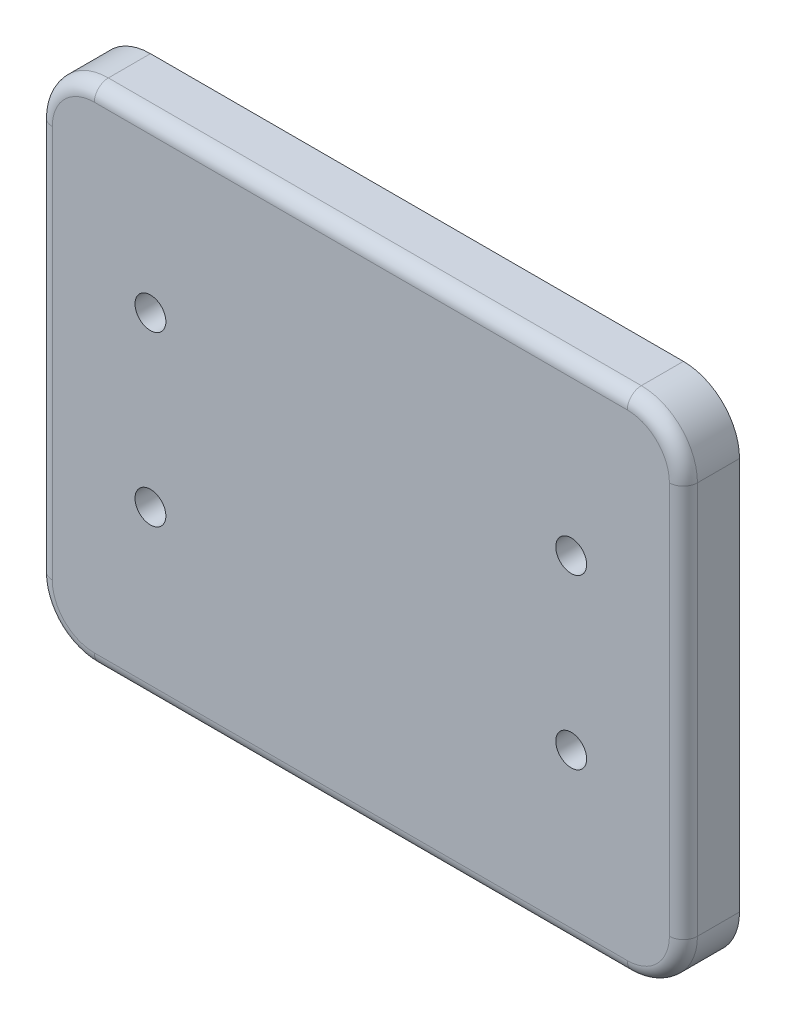
ISO-10303-21;
HEADER;
FILE_DESCRIPTION(('STEP AP214'),'2;1');
FILE_NAME('part.step','',(''),(''),'','','');
FILE_SCHEMA(('AUTOMOTIVE_DESIGN { 1 0 10303 214 1 1 1 1 }'));
ENDSEC;
DATA;
#1=APPLICATION_CONTEXT('core data for automotive mechanical design processes');
#2=APPLICATION_PROTOCOL_DEFINITION('international standard','automotive_design',2000,#1);
#3=PRODUCT_CONTEXT('',#1,'mechanical');
#4=PRODUCT('Part','Part','',(#3));
#5=PRODUCT_RELATED_PRODUCT_CATEGORY('part','',(#4));
#6=PRODUCT_DEFINITION_FORMATION('','',#4);
#7=PRODUCT_DEFINITION_CONTEXT('part definition',#1,'design');
#8=PRODUCT_DEFINITION('design','',#6,#7);
#9=PRODUCT_DEFINITION_SHAPE('','',#8);
#10=(LENGTH_UNIT() NAMED_UNIT(*) SI_UNIT(.MILLI.,.METRE.));
#11=(NAMED_UNIT(*) PLANE_ANGLE_UNIT() SI_UNIT($,.RADIAN.));
#12=(NAMED_UNIT(*) SI_UNIT($,.STERADIAN.) SOLID_ANGLE_UNIT());
#13=UNCERTAINTY_MEASURE_WITH_UNIT(LENGTH_MEASURE(1.E-05),#10,'distance_accuracy_value','');
#14=(GEOMETRIC_REPRESENTATION_CONTEXT(3) GLOBAL_UNCERTAINTY_ASSIGNED_CONTEXT((#13)) GLOBAL_UNIT_ASSIGNED_CONTEXT((#10,
#11,#12)) REPRESENTATION_CONTEXT('',''));
#15=CARTESIAN_POINT('',(0.,0.,0.));
#16=DIRECTION('',(0.,0.,1.));
#17=DIRECTION('',(1.,0.,0.));
#18=AXIS2_PLACEMENT_3D('',#15,#16,#17);
#19=CARTESIAN_POINT('',(75.,-30.,0.));
#20=DIRECTION('',(0.,0.,1.));
#21=DIRECTION('',(1.,0.,0.));
#22=AXIS2_PLACEMENT_3D('',#19,#20,#21);
#23=CYLINDRICAL_SURFACE('',#22,5.5);
#24=CARTESIAN_POINT('',(75.,-30.,20.));
#25=DIRECTION('',(0.,0.,-1.));
#26=DIRECTION('',(1.,0.,0.));
#27=AXIS2_PLACEMENT_3D('',#24,#25,#26);
#28=CIRCLE('',#27,5.5);
#29=CARTESIAN_POINT('',(80.5,-30.,20.));
#30=VERTEX_POINT('',#29);
#31=EDGE_CURVE('E245',#30,#30,#28,.T.);
#32=ORIENTED_EDGE('',*,*,#31,.F.);
#33=EDGE_LOOP('',(#32));
#34=FACE_BOUND('',#33,.T.);
#35=CARTESIAN_POINT('',(75.,-30.,11.));
#36=DIRECTION('',(0.,0.,-1.));
#37=DIRECTION('',(-1.,0.,0.));
#38=AXIS2_PLACEMENT_3D('',#35,#36,#37);
#39=CIRCLE('',#38,5.5);
#40=CARTESIAN_POINT('',(69.5,-30.,11.));
#41=VERTEX_POINT('',#40);
#42=EDGE_CURVE('E41',#41,#41,#39,.T.);
#43=ORIENTED_EDGE('',*,*,#42,.T.);
#44=EDGE_LOOP('',(#43));
#45=FACE_BOUND('',#44,.T.);
#46=ADVANCED_FACE('F37',(#34,#45),#23,.F.);
#47=CARTESIAN_POINT('',(-75.,-30.,0.));
#48=DIRECTION('',(0.,0.,1.));
#49=DIRECTION('',(1.,0.,0.));
#50=AXIS2_PLACEMENT_3D('',#47,#48,#49);
#51=CYLINDRICAL_SURFACE('',#50,5.5);
#52=CARTESIAN_POINT('',(-75.,-30.,20.));
#53=DIRECTION('',(0.,0.,-1.));
#54=DIRECTION('',(1.,0.,0.));
#55=AXIS2_PLACEMENT_3D('',#52,#53,#54);
#56=CIRCLE('',#55,5.5);
#57=CARTESIAN_POINT('',(-69.5,-30.,20.));
#58=VERTEX_POINT('',#57);
#59=EDGE_CURVE('E260',#58,#58,#56,.T.);
#60=ORIENTED_EDGE('',*,*,#59,.F.);
#61=EDGE_LOOP('',(#60));
#62=FACE_BOUND('',#61,.T.);
#63=CARTESIAN_POINT('',(-75.,-30.,11.));
#64=DIRECTION('',(0.,0.,-1.));
#65=DIRECTION('',(-1.,0.,0.));
#66=AXIS2_PLACEMENT_3D('',#63,#64,#65);
#67=CIRCLE('',#66,5.5);
#68=CARTESIAN_POINT('',(-80.5,-30.,11.));
#69=VERTEX_POINT('',#68);
#70=EDGE_CURVE('E239',#69,#69,#67,.T.);
#71=ORIENTED_EDGE('',*,*,#70,.T.);
#72=EDGE_LOOP('',(#71));
#73=FACE_BOUND('',#72,.T.);
#74=ADVANCED_FACE('F348',(#62,#73),#51,.F.);
#75=CARTESIAN_POINT('',(75.,30.,0.));
#76=DIRECTION('',(0.,0.,1.));
#77=DIRECTION('',(1.,0.,0.));
#78=AXIS2_PLACEMENT_3D('',#75,#76,#77);
#79=CYLINDRICAL_SURFACE('',#78,5.5);
#80=CARTESIAN_POINT('',(75.,30.,20.));
#81=DIRECTION('',(0.,0.,1.));
#82=DIRECTION('',(1.,0.,0.));
#83=AXIS2_PLACEMENT_3D('',#80,#81,#82);
#84=CIRCLE('',#83,5.5);
#85=CARTESIAN_POINT('',(80.5,30.,20.));
#86=VERTEX_POINT('',#85);
#87=EDGE_CURVE('E155',#86,#86,#84,.T.);
#88=ORIENTED_EDGE('',*,*,#87,.T.);
#89=EDGE_LOOP('',(#88));
#90=FACE_BOUND('',#89,.T.);
#91=CARTESIAN_POINT('',(75.,30.,11.));
#92=DIRECTION('',(0.,0.,-1.));
#93=DIRECTION('',(-1.,0.,0.));
#94=AXIS2_PLACEMENT_3D('',#91,#92,#93);
#95=CIRCLE('',#94,5.5);
#96=CARTESIAN_POINT('',(69.5,30.,11.));
#97=VERTEX_POINT('',#96);
#98=EDGE_CURVE('E236',#97,#97,#95,.F.);
#99=ORIENTED_EDGE('',*,*,#98,.F.);
#100=EDGE_LOOP('',(#99));
#101=FACE_BOUND('',#100,.T.);
#102=ADVANCED_FACE('F281',(#90,#101),#79,.F.);
#103=CARTESIAN_POINT('',(-75.,30.,0.));
#104=DIRECTION('',(0.,0.,1.));
#105=DIRECTION('',(1.,0.,0.));
#106=AXIS2_PLACEMENT_3D('',#103,#104,#105);
#107=CYLINDRICAL_SURFACE('',#106,5.5);
#108=CARTESIAN_POINT('',(-75.,30.,20.));
#109=DIRECTION('',(0.,0.,1.));
#110=DIRECTION('',(1.,0.,0.));
#111=AXIS2_PLACEMENT_3D('',#108,#109,#110);
#112=CIRCLE('',#111,5.5);
#113=CARTESIAN_POINT('',(-69.5,30.,20.));
#114=VERTEX_POINT('',#113);
#115=EDGE_CURVE('E217',#114,#114,#112,.T.);
#116=ORIENTED_EDGE('',*,*,#115,.T.);
#117=EDGE_LOOP('',(#116));
#118=FACE_BOUND('',#117,.T.);
#119=CARTESIAN_POINT('',(-75.,30.,11.));
#120=DIRECTION('',(0.,0.,-1.));
#121=DIRECTION('',(-1.,0.,0.));
#122=AXIS2_PLACEMENT_3D('',#119,#120,#121);
#123=CIRCLE('',#122,5.5);
#124=CARTESIAN_POINT('',(-80.5,30.,11.));
#125=VERTEX_POINT('',#124);
#126=EDGE_CURVE('E233',#125,#125,#123,.F.);
#127=ORIENTED_EDGE('',*,*,#126,.F.);
#128=EDGE_LOOP('',(#127));
#129=FACE_BOUND('',#128,.T.);
#130=ADVANCED_FACE('F377',(#118,#129),#107,.F.);
#131=CARTESIAN_POINT('',(-95.,70.,20.));
#132=DIRECTION('',(0.,0.,-1.));
#133=DIRECTION('',(-1.,0.,0.));
#134=AXIS2_PLACEMENT_3D('',#131,#132,#133);
#135=CYLINDRICAL_SURFACE('',#134,20.);
#136=DIRECTION('',(0.,0.,-1.));
#137=VECTOR('',#136,1.);
#138=CARTESIAN_POINT('',(-115.,69.9999999999999,20.));
#139=LINE('',#138,#137);
#140=CARTESIAN_POINT('',(-115.,69.9999999999999,15.));
#141=VERTEX_POINT('',#140);
#142=CARTESIAN_POINT('',(-115.,69.9999999999999,0.));
#143=VERTEX_POINT('',#142);
#144=EDGE_CURVE('E125',#141,#143,#139,.T.);
#145=ORIENTED_EDGE('',*,*,#144,.F.);
#146=CARTESIAN_POINT('',(-95.,70.,15.));
#147=DIRECTION('',(0.,0.,1.));
#148=DIRECTION('',(1.,0.,0.));
#149=AXIS2_PLACEMENT_3D('',#146,#147,#148);
#150=CIRCLE('',#149,20.);
#151=CARTESIAN_POINT('',(-94.9999999999998,90.,15.));
#152=VERTEX_POINT('',#151);
#153=EDGE_CURVE('E11',#141,#152,#150,.F.);
#154=ORIENTED_EDGE('',*,*,#153,.T.);
#155=DIRECTION('',(0.,0.,-1.));
#156=VECTOR('',#155,1.);
#157=CARTESIAN_POINT('',(-94.9999999999998,90.,20.));
#158=LINE('',#157,#156);
#159=CARTESIAN_POINT('',(-94.9999999999998,90.,0.));
#160=VERTEX_POINT('',#159);
#161=EDGE_CURVE('E147',#152,#160,#158,.T.);
#162=ORIENTED_EDGE('',*,*,#161,.T.);
#163=CARTESIAN_POINT('',(-95.,70.,0.));
#164=DIRECTION('',(0.,0.,1.));
#165=DIRECTION('',(1.,0.,0.));
#166=AXIS2_PLACEMENT_3D('',#163,#164,#165);
#167=CIRCLE('',#166,20.);
#168=EDGE_CURVE('E140',#160,#143,#167,.T.);
#169=ORIENTED_EDGE('',*,*,#168,.T.);
#170=EDGE_LOOP('',(#145,#154,#162,#169));
#171=FACE_BOUND('',#170,.T.);
#172=ADVANCED_FACE('F145',(#171),#135,.T.);
#173=CARTESIAN_POINT('',(-115.,69.9999999999999,20.));
#174=DIRECTION('',(1.,0.,0.));
#175=DIRECTION('',(0.,1.,0.));
#176=AXIS2_PLACEMENT_3D('',#173,#174,#175);
#177=PLANE('',#176);
#178=DIRECTION('',(0.,0.,-1.));
#179=VECTOR('',#178,1.);
#180=CARTESIAN_POINT('',(-115.,-70.,20.));
#181=LINE('',#180,#179);
#182=CARTESIAN_POINT('',(-115.,-70.,15.));
#183=VERTEX_POINT('',#182);
#184=CARTESIAN_POINT('',(-115.,-70.,0.));
#185=VERTEX_POINT('',#184);
#186=EDGE_CURVE('E134',#183,#185,#181,.T.);
#187=ORIENTED_EDGE('',*,*,#186,.F.);
#188=DIRECTION('',(0.,-1.,0.));
#189=VECTOR('',#188,1.);
#190=CARTESIAN_POINT('',(-115.,69.9999999999999,15.));
#191=LINE('',#190,#189);
#192=EDGE_CURVE('E46',#183,#141,#191,.F.);
#193=ORIENTED_EDGE('',*,*,#192,.T.);
#194=ORIENTED_EDGE('',*,*,#144,.T.);
#195=DIRECTION('',(0.,-1.,0.));
#196=VECTOR('',#195,1.);
#197=CARTESIAN_POINT('',(-115.,69.9999999999999,0.));
#198=LINE('',#197,#196);
#199=EDGE_CURVE('E128',#143,#185,#198,.T.);
#200=ORIENTED_EDGE('',*,*,#199,.T.);
#201=EDGE_LOOP('',(#187,#193,#194,#200));
#202=FACE_BOUND('',#201,.T.);
#203=ADVANCED_FACE('F127',(#202),#177,.F.);
#204=CARTESIAN_POINT('',(-95.,-70.,20.));
#205=DIRECTION('',(0.,0.,-1.));
#206=DIRECTION('',(-1.,0.,0.));
#207=AXIS2_PLACEMENT_3D('',#204,#205,#206);
#208=CYLINDRICAL_SURFACE('',#207,20.);
#209=DIRECTION('',(0.,0.,-1.));
#210=VECTOR('',#209,1.);
#211=CARTESIAN_POINT('',(-94.9999999999998,-90.,20.));
#212=LINE('',#211,#210);
#213=CARTESIAN_POINT('',(-94.9999999999998,-90.,15.));
#214=VERTEX_POINT('',#213);
#215=CARTESIAN_POINT('',(-94.9999999999998,-90.,0.));
#216=VERTEX_POINT('',#215);
#217=EDGE_CURVE('E182',#214,#216,#212,.T.);
#218=ORIENTED_EDGE('',*,*,#217,.F.);
#219=CARTESIAN_POINT('',(-95.,-70.,15.));
#220=DIRECTION('',(0.,0.,1.));
#221=DIRECTION('',(1.,0.,0.));
#222=AXIS2_PLACEMENT_3D('',#219,#220,#221);
#223=CIRCLE('',#222,20.);
#224=EDGE_CURVE('E61',#214,#183,#223,.F.);
#225=ORIENTED_EDGE('',*,*,#224,.T.);
#226=ORIENTED_EDGE('',*,*,#186,.T.);
#227=CARTESIAN_POINT('',(-95.,-70.,0.));
#228=DIRECTION('',(0.,0.,1.));
#229=DIRECTION('',(-1.,0.,0.));
#230=AXIS2_PLACEMENT_3D('',#227,#228,#229);
#231=CIRCLE('',#230,20.);
#232=EDGE_CURVE('E143',#185,#216,#231,.T.);
#233=ORIENTED_EDGE('',*,*,#232,.T.);
#234=EDGE_LOOP('',(#218,#225,#226,#233));
#235=FACE_BOUND('',#234,.T.);
#236=ADVANCED_FACE('F601',(#235),#208,.T.);
#237=CARTESIAN_POINT('',(94.9999999999999,-90.,20.));
#238=DIRECTION('',(0.,1.,0.));
#239=DIRECTION('',(-1.,0.,0.));
#240=AXIS2_PLACEMENT_3D('',#237,#238,#239);
#241=PLANE('',#240);
#242=DIRECTION('',(0.,0.,-1.));
#243=VECTOR('',#242,1.);
#244=CARTESIAN_POINT('',(94.9999999999999,-90.,20.));
#245=LINE('',#244,#243);
#246=CARTESIAN_POINT('',(94.9999999999999,-90.,15.));
#247=VERTEX_POINT('',#246);
#248=CARTESIAN_POINT('',(94.9999999999999,-90.,0.));
#249=VERTEX_POINT('',#248);
#250=EDGE_CURVE('E180',#247,#249,#245,.T.);
#251=ORIENTED_EDGE('',*,*,#250,.F.);
#252=DIRECTION('',(1.,0.,0.));
#253=VECTOR('',#252,1.);
#254=CARTESIAN_POINT('',(-94.9999999999998,-90.,15.));
#255=LINE('',#254,#253);
#256=EDGE_CURVE('E210',#247,#214,#255,.F.);
#257=ORIENTED_EDGE('',*,*,#256,.T.);
#258=ORIENTED_EDGE('',*,*,#217,.T.);
#259=DIRECTION('',(1.,0.,0.));
#260=VECTOR('',#259,1.);
#261=CARTESIAN_POINT('',(94.9999999999999,-90.,0.));
#262=LINE('',#261,#260);
#263=EDGE_CURVE('E159',#216,#249,#262,.T.);
#264=ORIENTED_EDGE('',*,*,#263,.T.);
#265=EDGE_LOOP('',(#251,#257,#258,#264));
#266=FACE_BOUND('',#265,.T.);
#267=ADVANCED_FACE('F591',(#266),#241,.F.);
#268=CARTESIAN_POINT('',(95.,-70.,20.));
#269=DIRECTION('',(0.,0.,-1.));
#270=DIRECTION('',(-1.,0.,0.));
#271=AXIS2_PLACEMENT_3D('',#268,#269,#270);
#272=CYLINDRICAL_SURFACE('',#271,20.);
#273=DIRECTION('',(0.,0.,-1.));
#274=VECTOR('',#273,1.);
#275=CARTESIAN_POINT('',(115.,-69.9999999999998,20.));
#276=LINE('',#275,#274);
#277=CARTESIAN_POINT('',(115.,-69.9999999999998,15.));
#278=VERTEX_POINT('',#277);
#279=CARTESIAN_POINT('',(115.,-69.9999999999998,0.));
#280=VERTEX_POINT('',#279);
#281=EDGE_CURVE('E178',#278,#280,#276,.T.);
#282=ORIENTED_EDGE('',*,*,#281,.F.);
#283=CARTESIAN_POINT('',(95.,-70.,15.));
#284=DIRECTION('',(0.,0.,1.));
#285=DIRECTION('',(1.,0.,0.));
#286=AXIS2_PLACEMENT_3D('',#283,#284,#285);
#287=CIRCLE('',#286,20.);
#288=EDGE_CURVE('E208',#278,#247,#287,.F.);
#289=ORIENTED_EDGE('',*,*,#288,.T.);
#290=ORIENTED_EDGE('',*,*,#250,.T.);
#291=CARTESIAN_POINT('',(95.,-70.,0.));
#292=DIRECTION('',(0.,0.,1.));
#293=DIRECTION('',(-1.,0.,0.));
#294=AXIS2_PLACEMENT_3D('',#291,#292,#293);
#295=CIRCLE('',#294,20.);
#296=EDGE_CURVE('E162',#249,#280,#295,.T.);
#297=ORIENTED_EDGE('',*,*,#296,.T.);
#298=EDGE_LOOP('',(#282,#289,#290,#297));
#299=FACE_BOUND('',#298,.T.);
#300=ADVANCED_FACE('F331',(#299),#272,.T.);
#301=CARTESIAN_POINT('',(115.,69.9999999999999,20.));
#302=DIRECTION('',(-1.,0.,0.));
#303=DIRECTION('',(0.,-1.,0.));
#304=AXIS2_PLACEMENT_3D('',#301,#302,#303);
#305=PLANE('',#304);
#306=DIRECTION('',(0.,0.,-1.));
#307=VECTOR('',#306,1.);
#308=CARTESIAN_POINT('',(115.,69.9999999999999,20.));
#309=LINE('',#308,#307);
#310=CARTESIAN_POINT('',(115.,69.9999999999999,15.));
#311=VERTEX_POINT('',#310);
#312=CARTESIAN_POINT('',(115.,69.9999999999999,0.));
#313=VERTEX_POINT('',#312);
#314=EDGE_CURVE('E176',#311,#313,#309,.T.);
#315=ORIENTED_EDGE('',*,*,#314,.F.);
#316=DIRECTION('',(0.,1.,0.));
#317=VECTOR('',#316,1.);
#318=CARTESIAN_POINT('',(115.,-69.9999999999998,15.));
#319=LINE('',#318,#317);
#320=EDGE_CURVE('E206',#311,#278,#319,.F.);
#321=ORIENTED_EDGE('',*,*,#320,.T.);
#322=ORIENTED_EDGE('',*,*,#281,.T.);
#323=DIRECTION('',(0.,1.,0.));
#324=VECTOR('',#323,1.);
#325=CARTESIAN_POINT('',(115.,69.9999999999999,0.));
#326=LINE('',#325,#324);
#327=EDGE_CURVE('E165',#280,#313,#326,.T.);
#328=ORIENTED_EDGE('',*,*,#327,.T.);
#329=EDGE_LOOP('',(#315,#321,#322,#328));
#330=FACE_BOUND('',#329,.T.);
#331=ADVANCED_FACE('F329',(#330),#305,.F.);
#332=CARTESIAN_POINT('',(95.,70.,20.));
#333=DIRECTION('',(0.,0.,-1.));
#334=DIRECTION('',(-1.,0.,0.));
#335=AXIS2_PLACEMENT_3D('',#332,#333,#334);
#336=CYLINDRICAL_SURFACE('',#335,20.);
#337=DIRECTION('',(0.,0.,-1.));
#338=VECTOR('',#337,1.);
#339=CARTESIAN_POINT('',(94.9999999999999,90.,20.));
#340=LINE('',#339,#338);
#341=CARTESIAN_POINT('',(94.9999999999999,90.,15.));
#342=VERTEX_POINT('',#341);
#343=CARTESIAN_POINT('',(94.9999999999999,90.,0.));
#344=VERTEX_POINT('',#343);
#345=EDGE_CURVE('E174',#342,#344,#340,.T.);
#346=ORIENTED_EDGE('',*,*,#345,.F.);
#347=CARTESIAN_POINT('',(95.,70.,15.));
#348=DIRECTION('',(0.,0.,1.));
#349=DIRECTION('',(1.,0.,0.));
#350=AXIS2_PLACEMENT_3D('',#347,#348,#349);
#351=CIRCLE('',#350,20.);
#352=EDGE_CURVE('E204',#342,#311,#351,.F.);
#353=ORIENTED_EDGE('',*,*,#352,.T.);
#354=ORIENTED_EDGE('',*,*,#314,.T.);
#355=CARTESIAN_POINT('',(95.,70.,0.));
#356=DIRECTION('',(0.,0.,1.));
#357=DIRECTION('',(-1.,0.,0.));
#358=AXIS2_PLACEMENT_3D('',#355,#356,#357);
#359=CIRCLE('',#358,20.);
#360=EDGE_CURVE('E168',#313,#344,#359,.T.);
#361=ORIENTED_EDGE('',*,*,#360,.T.);
#362=EDGE_LOOP('',(#346,#353,#354,#361));
#363=FACE_BOUND('',#362,.T.);
#364=ADVANCED_FACE('F338',(#363),#336,.T.);
#365=CARTESIAN_POINT('',(94.9999999999999,90.,20.));
#366=DIRECTION('',(0.,-1.,0.));
#367=DIRECTION('',(1.,0.,0.));
#368=AXIS2_PLACEMENT_3D('',#365,#366,#367);
#369=PLANE('',#368);
#370=ORIENTED_EDGE('',*,*,#161,.F.);
#371=DIRECTION('',(-1.,0.,0.));
#372=VECTOR('',#371,1.);
#373=CARTESIAN_POINT('',(94.9999999999998,90.,15.));
#374=LINE('',#373,#372);
#375=EDGE_CURVE('E201',#152,#342,#374,.F.);
#376=ORIENTED_EDGE('',*,*,#375,.T.);
#377=ORIENTED_EDGE('',*,*,#345,.T.);
#378=DIRECTION('',(-1.,0.,0.));
#379=VECTOR('',#378,1.);
#380=CARTESIAN_POINT('',(94.9999999999999,90.,0.));
#381=LINE('',#380,#379);
#382=EDGE_CURVE('E171',#344,#160,#381,.T.);
#383=ORIENTED_EDGE('',*,*,#382,.T.);
#384=EDGE_LOOP('',(#370,#376,#377,#383));
#385=FACE_BOUND('',#384,.T.);
#386=ADVANCED_FACE('F287',(#385),#369,.F.);
#387=CARTESIAN_POINT('',(-95.,70.,20.));
#388=DIRECTION('',(0.,0.,1.));
#389=DIRECTION('',(1.,0.,0.));
#390=AXIS2_PLACEMENT_3D('',#387,#388,#389);
#391=PLANE('',#390);
#392=ORIENTED_EDGE('',*,*,#59,.T.);
#393=EDGE_LOOP('',(#392));
#394=FACE_BOUND('',#393,.T.);
#395=ORIENTED_EDGE('',*,*,#31,.T.);
#396=EDGE_LOOP('',(#395));
#397=FACE_BOUND('',#396,.T.);
#398=ORIENTED_EDGE('',*,*,#115,.F.);
#399=EDGE_LOOP('',(#398));
#400=FACE_BOUND('',#399,.T.);
#401=ORIENTED_EDGE('',*,*,#87,.F.);
#402=EDGE_LOOP('',(#401));
#403=FACE_BOUND('',#402,.T.);
#404=CARTESIAN_POINT('',(95.,70.,20.));
#405=DIRECTION('',(0.,0.,1.));
#406=DIRECTION('',(1.,0.,0.));
#407=AXIS2_PLACEMENT_3D('',#404,#405,#406);
#408=CIRCLE('',#407,15.);
#409=CARTESIAN_POINT('',(110.,69.9999999999999,20.));
#410=VERTEX_POINT('',#409);
#411=CARTESIAN_POINT('',(94.9999999999999,85.,20.));
#412=VERTEX_POINT('',#411);
#413=EDGE_CURVE('E196',#410,#412,#408,.T.);
#414=ORIENTED_EDGE('',*,*,#413,.T.);
#415=DIRECTION('',(-1.,0.,0.));
#416=VECTOR('',#415,1.);
#417=CARTESIAN_POINT('',(-94.9999999999998,85.,20.));
#418=LINE('',#417,#416);
#419=CARTESIAN_POINT('',(-94.9999999999998,85.,20.));
#420=VERTEX_POINT('',#419);
#421=EDGE_CURVE('E198',#412,#420,#418,.T.);
#422=ORIENTED_EDGE('',*,*,#421,.T.);
#423=CARTESIAN_POINT('',(-95.,70.,20.));
#424=DIRECTION('',(0.,0.,1.));
#425=DIRECTION('',(1.,0.,0.));
#426=AXIS2_PLACEMENT_3D('',#423,#424,#425);
#427=CIRCLE('',#426,15.);
#428=CARTESIAN_POINT('',(-110.,69.9999999999999,20.));
#429=VERTEX_POINT('',#428);
#430=EDGE_CURVE('E133',#420,#429,#427,.T.);
#431=ORIENTED_EDGE('',*,*,#430,.T.);
#432=DIRECTION('',(0.,-1.,0.));
#433=VECTOR('',#432,1.);
#434=CARTESIAN_POINT('',(-110.,-70.,20.));
#435=LINE('',#434,#433);
#436=CARTESIAN_POINT('',(-110.,-70.,20.));
#437=VERTEX_POINT('',#436);
#438=EDGE_CURVE('E186',#429,#437,#435,.T.);
#439=ORIENTED_EDGE('',*,*,#438,.T.);
#440=CARTESIAN_POINT('',(-95.,-70.,20.));
#441=DIRECTION('',(0.,0.,1.));
#442=DIRECTION('',(1.,0.,0.));
#443=AXIS2_PLACEMENT_3D('',#440,#441,#442);
#444=CIRCLE('',#443,15.);
#445=CARTESIAN_POINT('',(-94.9999999999998,-85.,20.));
#446=VERTEX_POINT('',#445);
#447=EDGE_CURVE('E188',#437,#446,#444,.T.);
#448=ORIENTED_EDGE('',*,*,#447,.T.);
#449=DIRECTION('',(1.,0.,0.));
#450=VECTOR('',#449,1.);
#451=CARTESIAN_POINT('',(94.9999999999999,-85.,20.));
#452=LINE('',#451,#450);
#453=CARTESIAN_POINT('',(94.9999999999999,-85.,20.));
#454=VERTEX_POINT('',#453);
#455=EDGE_CURVE('E190',#446,#454,#452,.T.);
#456=ORIENTED_EDGE('',*,*,#455,.T.);
#457=CARTESIAN_POINT('',(95.,-70.,20.));
#458=DIRECTION('',(0.,0.,1.));
#459=DIRECTION('',(1.,0.,0.));
#460=AXIS2_PLACEMENT_3D('',#457,#458,#459);
#461=CIRCLE('',#460,15.);
#462=CARTESIAN_POINT('',(110.,-69.9999999999998,20.));
#463=VERTEX_POINT('',#462);
#464=EDGE_CURVE('E192',#454,#463,#461,.T.);
#465=ORIENTED_EDGE('',*,*,#464,.T.);
#466=DIRECTION('',(0.,1.,0.));
#467=VECTOR('',#466,1.);
#468=CARTESIAN_POINT('',(110.,69.9999999999999,20.));
#469=LINE('',#468,#467);
#470=EDGE_CURVE('E194',#463,#410,#469,.T.);
#471=ORIENTED_EDGE('',*,*,#470,.T.);
#472=EDGE_LOOP('',(#414,#422,#431,#439,#448,#456,#465,#471));
#473=FACE_BOUND('',#472,.T.);
#474=ADVANCED_FACE('F284',(#394,#397,#400,#403,#473),#391,.T.);
#475=CARTESIAN_POINT('',(-95.,70.,0.));
#476=DIRECTION('',(0.,0.,1.));
#477=DIRECTION('',(1.,0.,0.));
#478=AXIS2_PLACEMENT_3D('',#475,#476,#477);
#479=PLANE('',#478);
#480=CARTESIAN_POINT('',(75.,-30.,0.));
#481=DIRECTION('',(0.,0.,1.));
#482=DIRECTION('',(-1.,0.,0.));
#483=AXIS2_PLACEMENT_3D('',#480,#481,#482);
#484=CIRCLE('',#483,9.);
#485=CARTESIAN_POINT('',(66.,-30.,0.));
#486=VERTEX_POINT('',#485);
#487=EDGE_CURVE('E247',#486,#486,#484,.T.);
#488=ORIENTED_EDGE('',*,*,#487,.T.);
#489=EDGE_LOOP('',(#488));
#490=FACE_BOUND('',#489,.T.);
#491=CARTESIAN_POINT('',(-75.,-30.,0.));
#492=DIRECTION('',(0.,0.,1.));
#493=DIRECTION('',(-1.,0.,0.));
#494=AXIS2_PLACEMENT_3D('',#491,#492,#493);
#495=CIRCLE('',#494,9.);
#496=CARTESIAN_POINT('',(-84.,-30.,0.));
#497=VERTEX_POINT('',#496);
#498=EDGE_CURVE('E257',#497,#497,#495,.T.);
#499=ORIENTED_EDGE('',*,*,#498,.T.);
#500=EDGE_LOOP('',(#499));
#501=FACE_BOUND('',#500,.T.);
#502=CARTESIAN_POINT('',(75.,30.,0.));
#503=DIRECTION('',(0.,0.,-1.));
#504=DIRECTION('',(-1.,0.,0.));
#505=AXIS2_PLACEMENT_3D('',#502,#503,#504);
#506=CIRCLE('',#505,9.);
#507=CARTESIAN_POINT('',(66.,30.,0.));
#508=VERTEX_POINT('',#507);
#509=EDGE_CURVE('E268',#508,#508,#506,.T.);
#510=ORIENTED_EDGE('',*,*,#509,.F.);
#511=EDGE_LOOP('',(#510));
#512=FACE_BOUND('',#511,.T.);
#513=CARTESIAN_POINT('',(-75.,30.,0.));
#514=DIRECTION('',(0.,0.,-1.));
#515=DIRECTION('',(-1.,0.,0.));
#516=AXIS2_PLACEMENT_3D('',#513,#514,#515);
#517=CIRCLE('',#516,9.);
#518=CARTESIAN_POINT('',(-84.,30.,0.));
#519=VERTEX_POINT('',#518);
#520=EDGE_CURVE('E271',#519,#519,#517,.T.);
#521=ORIENTED_EDGE('',*,*,#520,.F.);
#522=EDGE_LOOP('',(#521));
#523=FACE_BOUND('',#522,.T.);
#524=ORIENTED_EDGE('',*,*,#168,.F.);
#525=ORIENTED_EDGE('',*,*,#382,.F.);
#526=ORIENTED_EDGE('',*,*,#360,.F.);
#527=ORIENTED_EDGE('',*,*,#327,.F.);
#528=ORIENTED_EDGE('',*,*,#296,.F.);
#529=ORIENTED_EDGE('',*,*,#263,.F.);
#530=ORIENTED_EDGE('',*,*,#232,.F.);
#531=ORIENTED_EDGE('',*,*,#199,.F.);
#532=EDGE_LOOP('',(#524,#525,#526,#527,#528,#529,#530,#531));
#533=FACE_BOUND('',#532,.T.);
#534=ADVANCED_FACE('F138',(#490,#501,#512,#523,#533),#479,.F.);
#535=CARTESIAN_POINT('',(-95.,-85.,15.));
#536=DIRECTION('',(-1.,0.,0.));
#537=DIRECTION('',(0.,-1.,0.));
#538=AXIS2_PLACEMENT_3D('',#535,#536,#537);
#539=CYLINDRICAL_SURFACE('',#538,5.);
#540=CARTESIAN_POINT('',(-94.9999999999998,-85.,15.));
#541=DIRECTION('',(-1.,0.,0.));
#542=DIRECTION('',(0.,0.,1.));
#543=AXIS2_PLACEMENT_3D('',#540,#541,#542);
#544=CIRCLE('',#543,5.);
#545=EDGE_CURVE('E152',#214,#446,#544,.T.);
#546=ORIENTED_EDGE('',*,*,#545,.F.);
#547=ORIENTED_EDGE('',*,*,#256,.F.);
#548=CARTESIAN_POINT('',(94.9999999999999,-85.,15.));
#549=DIRECTION('',(1.,0.,0.));
#550=DIRECTION('',(0.,1.,0.));
#551=AXIS2_PLACEMENT_3D('',#548,#549,#550);
#552=CIRCLE('',#551,5.);
#553=EDGE_CURVE('E149',#454,#247,#552,.T.);
#554=ORIENTED_EDGE('',*,*,#553,.F.);
#555=ORIENTED_EDGE('',*,*,#455,.F.);
#556=EDGE_LOOP('',(#546,#547,#554,#555));
#557=FACE_BOUND('',#556,.T.);
#558=ADVANCED_FACE('F39',(#557),#539,.T.);
#559=CARTESIAN_POINT('',(95.,-70.,15.));
#560=DIRECTION('',(0.,0.,1.));
#561=DIRECTION('',(1.,0.,0.));
#562=AXIS2_PLACEMENT_3D('',#559,#560,#561);
#563=TOROIDAL_SURFACE('',#562,15.,5.);
#564=ORIENTED_EDGE('',*,*,#553,.T.);
#565=ORIENTED_EDGE('',*,*,#288,.F.);
#566=CARTESIAN_POINT('',(110.,-69.9999999999998,15.));
#567=DIRECTION('',(0.,1.,0.));
#568=DIRECTION('',(0.,0.,1.));
#569=AXIS2_PLACEMENT_3D('',#566,#567,#568);
#570=CIRCLE('',#569,5.);
#571=EDGE_CURVE('E228',#463,#278,#570,.T.);
#572=ORIENTED_EDGE('',*,*,#571,.F.);
#573=ORIENTED_EDGE('',*,*,#464,.F.);
#574=EDGE_LOOP('',(#564,#565,#572,#573));
#575=FACE_BOUND('',#574,.T.);
#576=ADVANCED_FACE('F322',(#575),#563,.T.);
#577=CARTESIAN_POINT('',(-95.,-70.,15.));
#578=DIRECTION('',(0.,0.,1.));
#579=DIRECTION('',(1.,0.,0.));
#580=AXIS2_PLACEMENT_3D('',#577,#578,#579);
#581=TOROIDAL_SURFACE('',#580,15.,5.);
#582=ORIENTED_EDGE('',*,*,#545,.T.);
#583=ORIENTED_EDGE('',*,*,#447,.F.);
#584=CARTESIAN_POINT('',(-110.,-70.,15.));
#585=DIRECTION('',(0.,1.,0.));
#586=DIRECTION('',(0.,0.,1.));
#587=AXIS2_PLACEMENT_3D('',#584,#585,#586);
#588=CIRCLE('',#587,5.);
#589=EDGE_CURVE('E225',#183,#437,#588,.T.);
#590=ORIENTED_EDGE('',*,*,#589,.F.);
#591=ORIENTED_EDGE('',*,*,#224,.F.);
#592=EDGE_LOOP('',(#582,#583,#590,#591));
#593=FACE_BOUND('',#592,.T.);
#594=ADVANCED_FACE('F312',(#593),#581,.T.);
#595=CARTESIAN_POINT('',(110.,70.,15.));
#596=DIRECTION('',(0.,-1.,0.));
#597=DIRECTION('',(1.,0.,0.));
#598=AXIS2_PLACEMENT_3D('',#595,#596,#597);
#599=CYLINDRICAL_SURFACE('',#598,5.);
#600=ORIENTED_EDGE('',*,*,#571,.T.);
#601=ORIENTED_EDGE('',*,*,#320,.F.);
#602=CARTESIAN_POINT('',(110.,69.9999999999999,15.));
#603=DIRECTION('',(0.,1.,0.));
#604=DIRECTION('',(-1.,0.,0.));
#605=AXIS2_PLACEMENT_3D('',#602,#603,#604);
#606=CIRCLE('',#605,5.);
#607=EDGE_CURVE('E222',#410,#311,#606,.T.);
#608=ORIENTED_EDGE('',*,*,#607,.F.);
#609=ORIENTED_EDGE('',*,*,#470,.F.);
#610=EDGE_LOOP('',(#600,#601,#608,#609));
#611=FACE_BOUND('',#610,.T.);
#612=ADVANCED_FACE('F325',(#611),#599,.T.);
#613=CARTESIAN_POINT('',(-110.,70.,15.));
#614=DIRECTION('',(0.,1.,0.));
#615=DIRECTION('',(-1.,0.,0.));
#616=AXIS2_PLACEMENT_3D('',#613,#614,#615);
#617=CYLINDRICAL_SURFACE('',#616,5.);
#618=ORIENTED_EDGE('',*,*,#589,.T.);
#619=ORIENTED_EDGE('',*,*,#438,.F.);
#620=CARTESIAN_POINT('',(-110.,69.9999999999999,15.));
#621=DIRECTION('',(0.,1.,0.));
#622=DIRECTION('',(0.,0.,1.));
#623=AXIS2_PLACEMENT_3D('',#620,#621,#622);
#624=CIRCLE('',#623,5.);
#625=EDGE_CURVE('E219',#141,#429,#624,.T.);
#626=ORIENTED_EDGE('',*,*,#625,.F.);
#627=ORIENTED_EDGE('',*,*,#192,.F.);
#628=EDGE_LOOP('',(#618,#619,#626,#627));
#629=FACE_BOUND('',#628,.T.);
#630=ADVANCED_FACE('F309',(#629),#617,.T.);
#631=CARTESIAN_POINT('',(95.,70.,15.));
#632=DIRECTION('',(0.,0.,1.));
#633=DIRECTION('',(1.,0.,0.));
#634=AXIS2_PLACEMENT_3D('',#631,#632,#633);
#635=TOROIDAL_SURFACE('',#634,15.,5.);
#636=ORIENTED_EDGE('',*,*,#607,.T.);
#637=ORIENTED_EDGE('',*,*,#352,.F.);
#638=CARTESIAN_POINT('',(94.9999999999999,85.,15.));
#639=DIRECTION('',(-1.,0.,0.));
#640=DIRECTION('',(0.,0.,1.));
#641=AXIS2_PLACEMENT_3D('',#638,#639,#640);
#642=CIRCLE('',#641,5.);
#643=EDGE_CURVE('E216',#412,#342,#642,.T.);
#644=ORIENTED_EDGE('',*,*,#643,.F.);
#645=ORIENTED_EDGE('',*,*,#413,.F.);
#646=EDGE_LOOP('',(#636,#637,#644,#645));
#647=FACE_BOUND('',#646,.T.);
#648=ADVANCED_FACE('F297',(#647),#635,.T.);
#649=CARTESIAN_POINT('',(-95.,70.,15.));
#650=DIRECTION('',(0.,0.,1.));
#651=DIRECTION('',(1.,0.,0.));
#652=AXIS2_PLACEMENT_3D('',#649,#650,#651);
#653=TOROIDAL_SURFACE('',#652,15.,5.);
#654=ORIENTED_EDGE('',*,*,#625,.T.);
#655=ORIENTED_EDGE('',*,*,#430,.F.);
#656=CARTESIAN_POINT('',(-94.9999999999999,85.,15.));
#657=DIRECTION('',(1.,0.,0.));
#658=DIRECTION('',(0.,1.,0.));
#659=AXIS2_PLACEMENT_3D('',#656,#657,#658);
#660=CIRCLE('',#659,5.);
#661=EDGE_CURVE('E214',#152,#420,#660,.T.);
#662=ORIENTED_EDGE('',*,*,#661,.F.);
#663=ORIENTED_EDGE('',*,*,#153,.F.);
#664=EDGE_LOOP('',(#654,#655,#662,#663));
#665=FACE_BOUND('',#664,.T.);
#666=ADVANCED_FACE('F305',(#665),#653,.T.);
#667=CARTESIAN_POINT('',(-95.,85.,15.));
#668=DIRECTION('',(1.,0.,0.));
#669=DIRECTION('',(0.,1.,0.));
#670=AXIS2_PLACEMENT_3D('',#667,#668,#669);
#671=CYLINDRICAL_SURFACE('',#670,5.);
#672=ORIENTED_EDGE('',*,*,#643,.T.);
#673=ORIENTED_EDGE('',*,*,#375,.F.);
#674=ORIENTED_EDGE('',*,*,#661,.T.);
#675=ORIENTED_EDGE('',*,*,#421,.F.);
#676=EDGE_LOOP('',(#672,#673,#674,#675));
#677=FACE_BOUND('',#676,.T.);
#678=ADVANCED_FACE('F300',(#677),#671,.T.);
#679=CARTESIAN_POINT('',(-75.,30.,11.));
#680=DIRECTION('',(0.,0.,-1.));
#681=DIRECTION('',(-1.,0.,0.));
#682=AXIS2_PLACEMENT_3D('',#679,#680,#681);
#683=PLANE('',#682);
#684=CARTESIAN_POINT('',(-75.,30.,11.));
#685=DIRECTION('',(0.,0.,-1.));
#686=DIRECTION('',(-1.,0.,0.));
#687=AXIS2_PLACEMENT_3D('',#684,#685,#686);
#688=CIRCLE('',#687,9.);
#689=CARTESIAN_POINT('',(-84.,30.,11.));
#690=VERTEX_POINT('',#689);
#691=EDGE_CURVE('E263',#690,#690,#688,.T.);
#692=ORIENTED_EDGE('',*,*,#691,.T.);
#693=EDGE_LOOP('',(#692));
#694=FACE_BOUND('',#693,.T.);
#695=ORIENTED_EDGE('',*,*,#126,.T.);
#696=EDGE_LOOP('',(#695));
#697=FACE_BOUND('',#696,.T.);
#698=ADVANCED_FACE('F372',(#694,#697),#683,.T.);
#699=CARTESIAN_POINT('',(-75.,30.,11.));
#700=DIRECTION('',(0.,0.,-1.));
#701=DIRECTION('',(-1.,0.,0.));
#702=AXIS2_PLACEMENT_3D('',#699,#700,#701);
#703=CYLINDRICAL_SURFACE('',#702,9.);
#704=ORIENTED_EDGE('',*,*,#691,.F.);
#705=EDGE_LOOP('',(#704));
#706=FACE_BOUND('',#705,.T.);
#707=ORIENTED_EDGE('',*,*,#520,.T.);
#708=EDGE_LOOP('',(#707));
#709=FACE_BOUND('',#708,.T.);
#710=ADVANCED_FACE('F364',(#706,#709),#703,.F.);
#711=CARTESIAN_POINT('',(75.,30.,11.));
#712=DIRECTION('',(0.,0.,-1.));
#713=DIRECTION('',(-1.,0.,0.));
#714=AXIS2_PLACEMENT_3D('',#711,#712,#713);
#715=PLANE('',#714);
#716=CARTESIAN_POINT('',(75.,30.,11.));
#717=DIRECTION('',(0.,0.,-1.));
#718=DIRECTION('',(-1.,0.,0.));
#719=AXIS2_PLACEMENT_3D('',#716,#717,#718);
#720=CIRCLE('',#719,9.);
#721=CARTESIAN_POINT('',(66.,30.,11.));
#722=VERTEX_POINT('',#721);
#723=EDGE_CURVE('E237',#722,#722,#720,.T.);
#724=ORIENTED_EDGE('',*,*,#723,.T.);
#725=EDGE_LOOP('',(#724));
#726=FACE_BOUND('',#725,.T.);
#727=ORIENTED_EDGE('',*,*,#98,.T.);
#728=EDGE_LOOP('',(#727));
#729=FACE_BOUND('',#728,.T.);
#730=ADVANCED_FACE('F360',(#726,#729),#715,.T.);
#731=CARTESIAN_POINT('',(75.,30.,11.));
#732=DIRECTION('',(0.,0.,-1.));
#733=DIRECTION('',(-1.,0.,0.));
#734=AXIS2_PLACEMENT_3D('',#731,#732,#733);
#735=CYLINDRICAL_SURFACE('',#734,9.);
#736=ORIENTED_EDGE('',*,*,#723,.F.);
#737=EDGE_LOOP('',(#736));
#738=FACE_BOUND('',#737,.T.);
#739=ORIENTED_EDGE('',*,*,#509,.T.);
#740=EDGE_LOOP('',(#739));
#741=FACE_BOUND('',#740,.T.);
#742=ADVANCED_FACE('F363',(#738,#741),#735,.F.);
#743=CARTESIAN_POINT('',(-75.,-30.,11.));
#744=DIRECTION('',(0.,0.,-1.));
#745=DIRECTION('',(-1.,0.,0.));
#746=AXIS2_PLACEMENT_3D('',#743,#744,#745);
#747=CYLINDRICAL_SURFACE('',#746,9.);
#748=CARTESIAN_POINT('',(-75.,-30.,11.));
#749=DIRECTION('',(0.,0.,1.));
#750=DIRECTION('',(-1.,0.,0.));
#751=AXIS2_PLACEMENT_3D('',#748,#749,#750);
#752=CIRCLE('',#751,9.);
#753=CARTESIAN_POINT('',(-84.,-30.,11.));
#754=VERTEX_POINT('',#753);
#755=EDGE_CURVE('E252',#754,#754,#752,.T.);
#756=ORIENTED_EDGE('',*,*,#755,.T.);
#757=EDGE_LOOP('',(#756));
#758=FACE_BOUND('',#757,.T.);
#759=ORIENTED_EDGE('',*,*,#498,.F.);
#760=EDGE_LOOP('',(#759));
#761=FACE_BOUND('',#760,.T.);
#762=ADVANCED_FACE('F368',(#758,#761),#747,.F.);
#763=CARTESIAN_POINT('',(-75.,-30.,11.));
#764=DIRECTION('',(0.,0.,-1.));
#765=DIRECTION('',(-1.,0.,0.));
#766=AXIS2_PLACEMENT_3D('',#763,#764,#765);
#767=PLANE('',#766);
#768=ORIENTED_EDGE('',*,*,#70,.F.);
#769=EDGE_LOOP('',(#768));
#770=FACE_BOUND('',#769,.T.);
#771=ORIENTED_EDGE('',*,*,#755,.F.);
#772=EDGE_LOOP('',(#771));
#773=FACE_BOUND('',#772,.T.);
#774=ADVANCED_FACE('F397',(#770,#773),#767,.T.);
#775=CARTESIAN_POINT('',(75.,-30.,11.));
#776=DIRECTION('',(0.,0.,-1.));
#777=DIRECTION('',(-1.,0.,0.));
#778=AXIS2_PLACEMENT_3D('',#775,#776,#777);
#779=CYLINDRICAL_SURFACE('',#778,9.);
#780=CARTESIAN_POINT('',(75.,-30.,11.));
#781=DIRECTION('',(0.,0.,1.));
#782=DIRECTION('',(-1.,0.,0.));
#783=AXIS2_PLACEMENT_3D('',#780,#781,#782);
#784=CIRCLE('',#783,9.);
#785=CARTESIAN_POINT('',(66.,-30.,11.));
#786=VERTEX_POINT('',#785);
#787=EDGE_CURVE('E241',#786,#786,#784,.T.);
#788=ORIENTED_EDGE('',*,*,#787,.T.);
#789=EDGE_LOOP('',(#788));
#790=FACE_BOUND('',#789,.T.);
#791=ORIENTED_EDGE('',*,*,#487,.F.);
#792=EDGE_LOOP('',(#791));
#793=FACE_BOUND('',#792,.T.);
#794=ADVANCED_FACE('F402',(#790,#793),#779,.F.);
#795=CARTESIAN_POINT('',(75.,-30.,11.));
#796=DIRECTION('',(0.,0.,-1.));
#797=DIRECTION('',(-1.,0.,0.));
#798=AXIS2_PLACEMENT_3D('',#795,#796,#797);
#799=PLANE('',#798);
#800=ORIENTED_EDGE('',*,*,#42,.F.);
#801=EDGE_LOOP('',(#800));
#802=FACE_BOUND('',#801,.T.);
#803=ORIENTED_EDGE('',*,*,#787,.F.);
#804=EDGE_LOOP('',(#803));
#805=FACE_BOUND('',#804,.T.);
#806=ADVANCED_FACE('F408',(#802,#805),#799,.T.);
#807=CLOSED_SHELL('',(#46,#74,#102,#130,#172,#203,#236,#267,#300,#331,#364,#386,#474,#534,#558,
#576,#594,#612,#630,#648,#666,#678,#698,#710,#730,#742,#762,#774,#794,#806));
#808=MANIFOLD_SOLID_BREP('B2',#807);
#809=ADVANCED_BREP_SHAPE_REPRESENTATION('',(#18,#808),#14);
#810=SHAPE_DEFINITION_REPRESENTATION(#9,#809);
ENDSEC;
END-ISO-10303-21;
